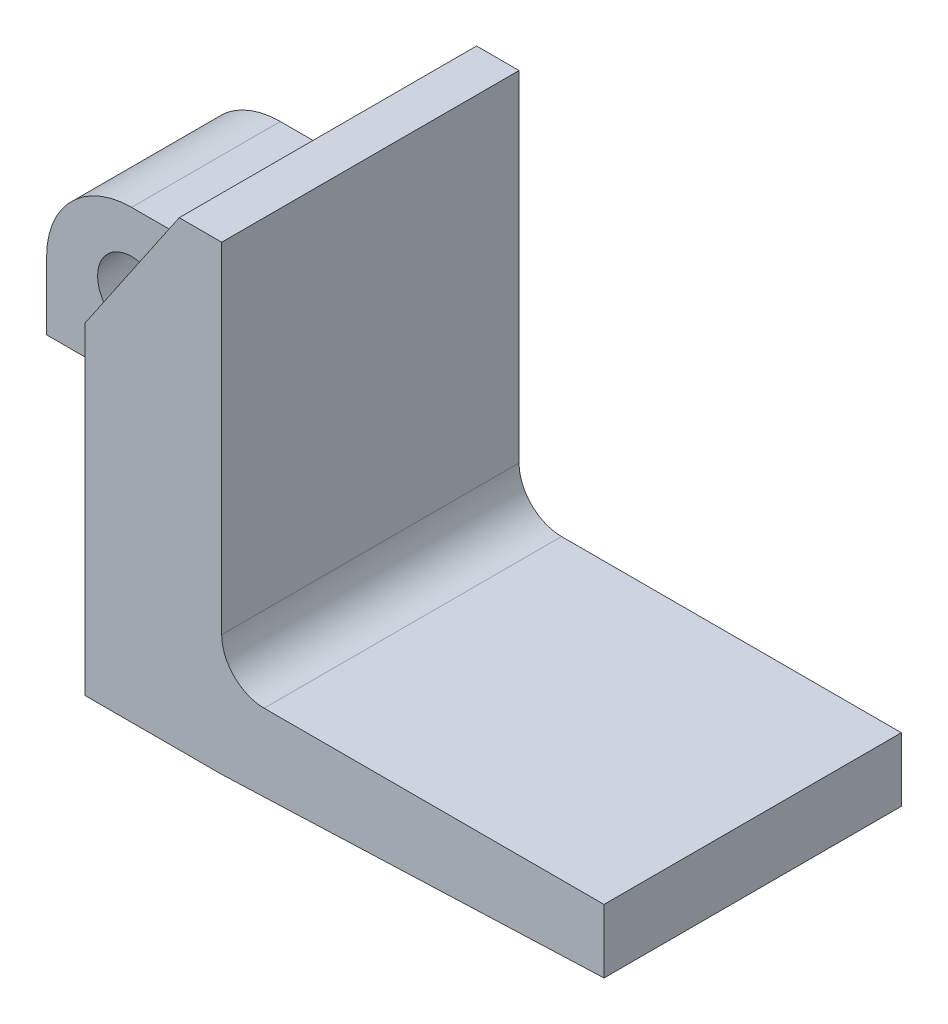
ISO-10303-21;
HEADER;
FILE_DESCRIPTION(('STEP AP214'),'2;1');
FILE_NAME('part.step','',(''),(''),'','','');
FILE_SCHEMA(('AUTOMOTIVE_DESIGN { 1 0 10303 214 1 1 1 1 }'));
ENDSEC;
DATA;
#1=APPLICATION_CONTEXT('core data for automotive mechanical design processes');
#2=APPLICATION_PROTOCOL_DEFINITION('international standard','automotive_design',2000,#1);
#3=PRODUCT_CONTEXT('',#1,'mechanical');
#4=PRODUCT('Part','Part','',(#3));
#5=PRODUCT_RELATED_PRODUCT_CATEGORY('part','',(#4));
#6=PRODUCT_DEFINITION_FORMATION('','',#4);
#7=PRODUCT_DEFINITION_CONTEXT('part definition',#1,'design');
#8=PRODUCT_DEFINITION('design','',#6,#7);
#9=PRODUCT_DEFINITION_SHAPE('','',#8);
#10=(LENGTH_UNIT() NAMED_UNIT(*) SI_UNIT(.MILLI.,.METRE.));
#11=(NAMED_UNIT(*) PLANE_ANGLE_UNIT() SI_UNIT($,.RADIAN.));
#12=(NAMED_UNIT(*) SI_UNIT($,.STERADIAN.) SOLID_ANGLE_UNIT());
#13=UNCERTAINTY_MEASURE_WITH_UNIT(LENGTH_MEASURE(1.E-05),#10,'distance_accuracy_value','');
#14=(GEOMETRIC_REPRESENTATION_CONTEXT(3) GLOBAL_UNCERTAINTY_ASSIGNED_CONTEXT((#13)) GLOBAL_UNIT_ASSIGNED_CONTEXT((#10,
#11,#12)) REPRESENTATION_CONTEXT('',''));
#15=CARTESIAN_POINT('',(0.,0.,0.));
#16=DIRECTION('',(0.,0.,1.));
#17=DIRECTION('',(1.,0.,0.));
#18=AXIS2_PLACEMENT_3D('',#15,#16,#17);
#19=CARTESIAN_POINT('',(-35.6902,32.7054976,44.45));
#20=DIRECTION('',(0.,-1.,0.));
#21=DIRECTION('',(1.,0.,0.));
#22=AXIS2_PLACEMENT_3D('',#19,#20,#21);
#23=PLANE('',#22);
#24=DIRECTION('',(-1.,0.,0.));
#25=VECTOR('',#24,1.);
#26=CARTESIAN_POINT('',(-22.9902,32.7054976,22.225));
#27=LINE('',#26,#25);
#28=CARTESIAN_POINT('',(-24.333799736365,32.7054976,22.225));
#29=VERTEX_POINT('',#28);
#30=CARTESIAN_POINT('',(-35.6902,32.7054976,22.225));
#31=VERTEX_POINT('',#30);
#32=EDGE_CURVE('E209',#29,#31,#27,.T.);
#33=ORIENTED_EDGE('',*,*,#32,.F.);
#34=DIRECTION('',(0.,0.,-1.));
#35=VECTOR('',#34,1.);
#36=CARTESIAN_POINT('',(-24.333799736365,32.7054976,0.));
#37=LINE('',#36,#35);
#38=CARTESIAN_POINT('',(-24.333799736365,32.7054976,0.));
#39=VERTEX_POINT('',#38);
#40=EDGE_CURVE('E200',#29,#39,#37,.T.);
#41=ORIENTED_EDGE('',*,*,#40,.T.);
#42=DIRECTION('',(-1.,0.,0.));
#43=VECTOR('',#42,1.);
#44=CARTESIAN_POINT('',(-35.6902,32.7054976,0.));
#45=LINE('',#44,#43);
#46=CARTESIAN_POINT('',(-35.6902,32.7054976,0.));
#47=VERTEX_POINT('',#46);
#48=EDGE_CURVE('E208',#39,#47,#45,.T.);
#49=ORIENTED_EDGE('',*,*,#48,.T.);
#50=DIRECTION('',(0.,0.,-1.));
#51=VECTOR('',#50,1.);
#52=CARTESIAN_POINT('',(-35.6902,32.7054976,44.45));
#53=LINE('',#52,#51);
#54=EDGE_CURVE('E177',#31,#47,#53,.T.);
#55=ORIENTED_EDGE('',*,*,#54,.F.);
#56=EDGE_LOOP('',(#33,#41,#49,#55));
#57=FACE_BOUND('',#56,.T.);
#58=ADVANCED_FACE('F43',(#57),#23,.F.);
#59=CARTESIAN_POINT('',(-35.6902,20.0054976,44.45));
#60=DIRECTION('',(0.,0.,-1.));
#61=DIRECTION('',(-1.,0.,0.));
#62=AXIS2_PLACEMENT_3D('',#59,#60,#61);
#63=CYLINDRICAL_SURFACE('',#62,12.7);
#64=CARTESIAN_POINT('',(-35.6902,20.0054976,22.225));
#65=DIRECTION('',(0.,0.,1.));
#66=DIRECTION('',(1.,0.,0.));
#67=AXIS2_PLACEMENT_3D('',#64,#65,#66);
#68=CIRCLE('',#67,12.7);
#69=CARTESIAN_POINT('',(-48.3902,20.0054976,22.225));
#70=VERTEX_POINT('',#69);
#71=EDGE_CURVE('E158',#31,#70,#68,.T.);
#72=ORIENTED_EDGE('',*,*,#71,.F.);
#73=ORIENTED_EDGE('',*,*,#54,.T.);
#74=CARTESIAN_POINT('',(-35.6902,20.0054976,0.));
#75=DIRECTION('',(0.,0.,1.));
#76=DIRECTION('',(1.,0.,0.));
#77=AXIS2_PLACEMENT_3D('',#74,#75,#76);
#78=CIRCLE('',#77,12.7);
#79=CARTESIAN_POINT('',(-48.3902,20.0054976,0.));
#80=VERTEX_POINT('',#79);
#81=EDGE_CURVE('E216',#47,#80,#78,.T.);
#82=ORIENTED_EDGE('',*,*,#81,.T.);
#83=DIRECTION('',(0.,0.,-1.));
#84=VECTOR('',#83,1.);
#85=CARTESIAN_POINT('',(-48.3902,20.0054976,44.45));
#86=LINE('',#85,#84);
#87=EDGE_CURVE('E175',#70,#80,#86,.T.);
#88=ORIENTED_EDGE('',*,*,#87,.F.);
#89=EDGE_LOOP('',(#72,#73,#82,#88));
#90=FACE_BOUND('',#89,.T.);
#91=ADVANCED_FACE('F329',(#90),#63,.T.);
#92=CARTESIAN_POINT('',(-48.3902,9.8454976,44.45));
#93=DIRECTION('',(1.,0.,0.));
#94=DIRECTION('',(0.,1.,0.));
#95=AXIS2_PLACEMENT_3D('',#92,#93,#94);
#96=PLANE('',#95);
#97=DIRECTION('',(0.,-1.,0.));
#98=VECTOR('',#97,1.);
#99=CARTESIAN_POINT('',(-48.3902,20.0054976,22.225));
#100=LINE('',#99,#98);
#101=CARTESIAN_POINT('',(-48.3902,9.8454976,22.225));
#102=VERTEX_POINT('',#101);
#103=EDGE_CURVE('E151',#70,#102,#100,.T.);
#104=ORIENTED_EDGE('',*,*,#103,.F.);
#105=ORIENTED_EDGE('',*,*,#87,.T.);
#106=DIRECTION('',(0.,-1.,0.));
#107=VECTOR('',#106,1.);
#108=CARTESIAN_POINT('',(-48.3902,9.8454976,0.));
#109=LINE('',#108,#107);
#110=CARTESIAN_POINT('',(-48.3902,9.8454976,0.));
#111=VERTEX_POINT('',#110);
#112=EDGE_CURVE('E173',#80,#111,#109,.T.);
#113=ORIENTED_EDGE('',*,*,#112,.T.);
#114=DIRECTION('',(0.,0.,-1.));
#115=VECTOR('',#114,1.);
#116=CARTESIAN_POINT('',(-48.3902,9.8454976,44.45));
#117=LINE('',#116,#115);
#118=EDGE_CURVE('E166',#102,#111,#117,.T.);
#119=ORIENTED_EDGE('',*,*,#118,.F.);
#120=EDGE_LOOP('',(#104,#105,#113,#119));
#121=FACE_BOUND('',#120,.T.);
#122=ADVANCED_FACE('F171',(#121),#96,.F.);
#123=CARTESIAN_POINT('',(-20.4502,9.84549760000001,44.45));
#124=DIRECTION('',(0.,1.,0.));
#125=DIRECTION('',(-1.,0.,0.));
#126=AXIS2_PLACEMENT_3D('',#123,#124,#125);
#127=PLANE('',#126);
#128=DIRECTION('',(1.,0.,0.));
#129=VECTOR('',#128,1.);
#130=CARTESIAN_POINT('',(-48.3902,9.8454976,22.225));
#131=LINE('',#130,#129);
#132=CARTESIAN_POINT('',(-20.4502,9.84549760000001,22.225));
#133=VERTEX_POINT('',#132);
#134=EDGE_CURVE('E155',#102,#133,#131,.T.);
#135=ORIENTED_EDGE('',*,*,#134,.F.);
#136=ORIENTED_EDGE('',*,*,#118,.T.);
#137=DIRECTION('',(1.,0.,0.));
#138=VECTOR('',#137,1.);
#139=CARTESIAN_POINT('',(-20.4502,9.84549760000001,0.));
#140=LINE('',#139,#138);
#141=CARTESIAN_POINT('',(-20.4502,9.84549760000001,0.));
#142=VERTEX_POINT('',#141);
#143=EDGE_CURVE('E225',#111,#142,#140,.T.);
#144=ORIENTED_EDGE('',*,*,#143,.T.);
#145=DIRECTION('',(0.,0.,-1.));
#146=VECTOR('',#145,1.);
#147=CARTESIAN_POINT('',(-20.4502,9.84549760000001,44.45));
#148=LINE('',#147,#146);
#149=EDGE_CURVE('E168',#133,#142,#148,.T.);
#150=ORIENTED_EDGE('',*,*,#149,.F.);
#151=EDGE_LOOP('',(#135,#136,#144,#150));
#152=FACE_BOUND('',#151,.T.);
#153=ADVANCED_FACE('F164',(#152),#127,.F.);
#154=CARTESIAN_POINT('',(0.,57.15,44.45));
#155=DIRECTION('',(-1.,0.,0.));
#156=DIRECTION('',(0.,-1.,0.));
#157=AXIS2_PLACEMENT_3D('',#154,#155,#156);
#158=PLANE('',#157);
#159=DIRECTION('',(0.,1.,0.));
#160=VECTOR('',#159,1.);
#161=CARTESIAN_POINT('',(0.,57.15,44.45));
#162=LINE('',#161,#160);
#163=CARTESIAN_POINT('',(0.,6.35,44.45));
#164=VERTEX_POINT('',#163);
#165=CARTESIAN_POINT('',(0.,57.15,44.45));
#166=VERTEX_POINT('',#165);
#167=EDGE_CURVE('E238',#164,#166,#162,.T.);
#168=ORIENTED_EDGE('',*,*,#167,.F.);
#169=DIRECTION('',(0.,0.,-1.));
#170=VECTOR('',#169,1.);
#171=CARTESIAN_POINT('',(0.,6.35,0.));
#172=LINE('',#171,#170);
#173=CARTESIAN_POINT('',(0.,6.35,0.));
#174=VERTEX_POINT('',#173);
#175=EDGE_CURVE('E191',#164,#174,#172,.T.);
#176=ORIENTED_EDGE('',*,*,#175,.T.);
#177=DIRECTION('',(0.,1.,0.));
#178=VECTOR('',#177,1.);
#179=CARTESIAN_POINT('',(0.,57.15,0.));
#180=LINE('',#179,#178);
#181=CARTESIAN_POINT('',(0.,57.15,0.));
#182=VERTEX_POINT('',#181);
#183=EDGE_CURVE('E279',#174,#182,#180,.T.);
#184=ORIENTED_EDGE('',*,*,#183,.T.);
#185=DIRECTION('',(0.,0.,-1.));
#186=VECTOR('',#185,1.);
#187=CARTESIAN_POINT('',(0.,57.15,44.45));
#188=LINE('',#187,#186);
#189=EDGE_CURVE('E188',#166,#182,#188,.T.);
#190=ORIENTED_EDGE('',*,*,#189,.F.);
#191=EDGE_LOOP('',(#168,#176,#184,#190));
#192=FACE_BOUND('',#191,.T.);
#193=ADVANCED_FACE('F310',(#192),#158,.F.);
#194=CARTESIAN_POINT('',(-6.35,57.15,44.45));
#195=DIRECTION('',(0.,-1.,0.));
#196=DIRECTION('',(0.,0.,-1.));
#197=AXIS2_PLACEMENT_3D('',#194,#195,#196);
#198=PLANE('',#197);
#199=DIRECTION('',(-1.,0.,0.));
#200=VECTOR('',#199,1.);
#201=CARTESIAN_POINT('',(-6.35,57.15,0.));
#202=LINE('',#201,#200);
#203=CARTESIAN_POINT('',(-6.35,57.15,0.));
#204=VERTEX_POINT('',#203);
#205=EDGE_CURVE('E220',#182,#204,#202,.T.);
#206=ORIENTED_EDGE('',*,*,#205,.T.);
#207=DIRECTION('',(0.,0.,-1.));
#208=VECTOR('',#207,1.);
#209=CARTESIAN_POINT('',(-6.35,57.15,44.45));
#210=LINE('',#209,#208);
#211=CARTESIAN_POINT('',(-6.35,57.15,44.45));
#212=VERTEX_POINT('',#211);
#213=EDGE_CURVE('E185',#212,#204,#210,.T.);
#214=ORIENTED_EDGE('',*,*,#213,.F.);
#215=DIRECTION('',(-1.,0.,0.));
#216=VECTOR('',#215,1.);
#217=CARTESIAN_POINT('',(-6.35,57.15,44.45));
#218=LINE('',#217,#216);
#219=EDGE_CURVE('E293',#166,#212,#218,.T.);
#220=ORIENTED_EDGE('',*,*,#219,.F.);
#221=ORIENTED_EDGE('',*,*,#189,.T.);
#222=EDGE_LOOP('',(#206,#214,#220,#221));
#223=FACE_BOUND('',#222,.T.);
#224=ADVANCED_FACE('F284',(#223),#198,.F.);
#225=CARTESIAN_POINT('',(-22.9902,32.7054976,44.45));
#226=DIRECTION('',(0.826644323966202,-0.56272476545329,0.));
#227=DIRECTION('',(0.56272476545329,0.826644323966202,0.));
#228=AXIS2_PLACEMENT_3D('',#225,#226,#227);
#229=PLANE('',#228);
#230=DIRECTION('',(-0.56272476545329,-0.826644323966202,0.));
#231=VECTOR('',#230,1.);
#232=CARTESIAN_POINT('',(-22.9902,32.7054976,0.));
#233=LINE('',#232,#231);
#234=CARTESIAN_POINT('',(-22.2341231534909,33.8161766957486,0.));
#235=VERTEX_POINT('',#234);
#236=EDGE_CURVE('E217',#204,#235,#233,.T.);
#237=ORIENTED_EDGE('',*,*,#236,.T.);
#238=DIRECTION('',(0.,0.,-1.));
#239=VECTOR('',#238,1.);
#240=CARTESIAN_POINT('',(-22.2341231534909,33.8161766957486,22.225));
#241=LINE('',#240,#239);
#242=CARTESIAN_POINT('',(-22.2341231534909,33.8161766957486,22.225));
#243=VERTEX_POINT('',#242);
#244=EDGE_CURVE('E65',#235,#243,#241,.F.);
#245=ORIENTED_EDGE('',*,*,#244,.T.);
#246=DIRECTION('',(-0.562724765453292,-0.826644323966201,0.));
#247=VECTOR('',#246,1.);
#248=CARTESIAN_POINT('',(-20.4502,36.4367650184204,22.225));
#249=LINE('',#248,#247);
#250=CARTESIAN_POINT('',(-20.4502,36.4367650184204,22.225));
#251=VERTEX_POINT('',#250);
#252=EDGE_CURVE('E301',#251,#243,#249,.T.);
#253=ORIENTED_EDGE('',*,*,#252,.F.);
#254=DIRECTION('',(0.,0.,1.));
#255=VECTOR('',#254,1.);
#256=CARTESIAN_POINT('',(-20.4502,36.4367650184204,22.225));
#257=LINE('',#256,#255);
#258=CARTESIAN_POINT('',(-20.4502,36.4367650184204,44.45));
#259=VERTEX_POINT('',#258);
#260=EDGE_CURVE('E280',#251,#259,#257,.T.);
#261=ORIENTED_EDGE('',*,*,#260,.T.);
#262=DIRECTION('',(-0.56272476545329,-0.826644323966202,0.));
#263=VECTOR('',#262,1.);
#264=CARTESIAN_POINT('',(-22.9902,32.7054976,44.45));
#265=LINE('',#264,#263);
#266=EDGE_CURVE('E291',#212,#259,#265,.T.);
#267=ORIENTED_EDGE('',*,*,#266,.F.);
#268=ORIENTED_EDGE('',*,*,#213,.T.);
#269=EDGE_LOOP('',(#237,#245,#253,#261,#267,#268));
#270=FACE_BOUND('',#269,.T.);
#271=ADVANCED_FACE('F288',(#270),#229,.F.);
#272=CARTESIAN_POINT('',(-20.4502,9.84549760000001,44.45));
#273=DIRECTION('',(1.,0.,0.));
#274=DIRECTION('',(0.,1.,0.));
#275=AXIS2_PLACEMENT_3D('',#272,#273,#274);
#276=PLANE('',#275);
#277=DIRECTION('',(0.,-1.,0.));
#278=VECTOR('',#277,1.);
#279=CARTESIAN_POINT('',(-20.4502,9.84549760000001,0.));
#280=LINE('',#279,#278);
#281=CARTESIAN_POINT('',(-20.4502,-11.7445024,0.));
#282=VERTEX_POINT('',#281);
#283=EDGE_CURVE('E227',#142,#282,#280,.T.);
#284=ORIENTED_EDGE('',*,*,#283,.T.);
#285=DIRECTION('',(0.,0.,-1.));
#286=VECTOR('',#285,1.);
#287=CARTESIAN_POINT('',(-20.4502,-11.7445024,44.45));
#288=LINE('',#287,#286);
#289=CARTESIAN_POINT('',(-20.4502,-11.7445024,44.45));
#290=VERTEX_POINT('',#289);
#291=EDGE_CURVE('E179',#290,#282,#288,.T.);
#292=ORIENTED_EDGE('',*,*,#291,.F.);
#293=DIRECTION('',(0.,-1.,0.));
#294=VECTOR('',#293,1.);
#295=CARTESIAN_POINT('',(-20.4502,9.84549760000001,44.45));
#296=LINE('',#295,#294);
#297=EDGE_CURVE('E292',#259,#290,#296,.T.);
#298=ORIENTED_EDGE('',*,*,#297,.F.);
#299=ORIENTED_EDGE('',*,*,#260,.F.);
#300=DIRECTION('',(0.,1.,0.));
#301=VECTOR('',#300,1.);
#302=CARTESIAN_POINT('',(-20.4502,9.84549760000001,22.225));
#303=LINE('',#302,#301);
#304=EDGE_CURVE('E169',#133,#251,#303,.T.);
#305=ORIENTED_EDGE('',*,*,#304,.F.);
#306=ORIENTED_EDGE('',*,*,#149,.T.);
#307=EDGE_LOOP('',(#284,#292,#298,#299,#305,#306));
#308=FACE_BOUND('',#307,.T.);
#309=ADVANCED_FACE('F299',(#308),#276,.F.);
#310=CARTESIAN_POINT('',(-20.4502,-11.7445024,44.45));
#311=DIRECTION('',(0.,1.,0.));
#312=DIRECTION('',(-1.,0.,0.));
#313=AXIS2_PLACEMENT_3D('',#310,#311,#312);
#314=PLANE('',#313);
#315=DIRECTION('',(1.,0.,0.));
#316=VECTOR('',#315,1.);
#317=CARTESIAN_POINT('',(-20.4502,-11.7445024,0.));
#318=LINE('',#317,#316);
#319=CARTESIAN_POINT('',(0.,-11.7445024,0.));
#320=VERTEX_POINT('',#319);
#321=EDGE_CURVE('E229',#282,#320,#318,.T.);
#322=ORIENTED_EDGE('',*,*,#321,.T.);
#323=DIRECTION('',(0.,0.,-1.));
#324=VECTOR('',#323,1.);
#325=CARTESIAN_POINT('',(0.,-11.7445024,44.45));
#326=LINE('',#325,#324);
#327=CARTESIAN_POINT('',(0.,-11.7445024,44.45));
#328=VERTEX_POINT('',#327);
#329=EDGE_CURVE('E246',#328,#320,#326,.T.);
#330=ORIENTED_EDGE('',*,*,#329,.F.);
#331=DIRECTION('',(1.,0.,0.));
#332=VECTOR('',#331,1.);
#333=CARTESIAN_POINT('',(-20.4502,-11.7445024,44.45));
#334=LINE('',#333,#332);
#335=EDGE_CURVE('E255',#290,#328,#334,.T.);
#336=ORIENTED_EDGE('',*,*,#335,.F.);
#337=ORIENTED_EDGE('',*,*,#291,.T.);
#338=EDGE_LOOP('',(#322,#330,#336,#337));
#339=FACE_BOUND('',#338,.T.);
#340=ADVANCED_FACE('F253',(#339),#314,.F.);
#341=CARTESIAN_POINT('',(0.,-11.7445024,44.45));
#342=DIRECTION('',(-0.0388071826393708,0.999246717570588,0.));
#343=DIRECTION('',(-0.999246717570588,-0.0388071826393708,0.));
#344=AXIS2_PLACEMENT_3D('',#341,#342,#343);
#345=PLANE('',#344);
#346=DIRECTION('',(0.999246717570588,0.0388071826393708,0.));
#347=VECTOR('',#346,1.);
#348=CARTESIAN_POINT('',(0.,-11.7445024,0.));
#349=LINE('',#348,#347);
#350=CARTESIAN_POINT('',(57.15,-9.525,0.));
#351=VERTEX_POINT('',#350);
#352=EDGE_CURVE('E231',#320,#351,#349,.T.);
#353=ORIENTED_EDGE('',*,*,#352,.T.);
#354=DIRECTION('',(0.,0.,-1.));
#355=VECTOR('',#354,1.);
#356=CARTESIAN_POINT('',(57.15,-9.525,44.45));
#357=LINE('',#356,#355);
#358=CARTESIAN_POINT('',(57.15,-9.525,44.45));
#359=VERTEX_POINT('',#358);
#360=EDGE_CURVE('E242',#359,#351,#357,.T.);
#361=ORIENTED_EDGE('',*,*,#360,.F.);
#362=DIRECTION('',(0.999246717570588,0.0388071826393708,0.));
#363=VECTOR('',#362,1.);
#364=CARTESIAN_POINT('',(0.,-11.7445024,44.45));
#365=LINE('',#364,#363);
#366=EDGE_CURVE('E273',#328,#359,#365,.T.);
#367=ORIENTED_EDGE('',*,*,#366,.F.);
#368=ORIENTED_EDGE('',*,*,#329,.T.);
#369=EDGE_LOOP('',(#353,#361,#367,#368));
#370=FACE_BOUND('',#369,.T.);
#371=ADVANCED_FACE('F263',(#370),#345,.F.);
#372=CARTESIAN_POINT('',(57.15,0.,44.45));
#373=DIRECTION('',(-1.,0.,0.));
#374=DIRECTION('',(0.,-1.,0.));
#375=AXIS2_PLACEMENT_3D('',#372,#373,#374);
#376=PLANE('',#375);
#377=DIRECTION('',(0.,1.,0.));
#378=VECTOR('',#377,1.);
#379=CARTESIAN_POINT('',(57.15,0.,0.));
#380=LINE('',#379,#378);
#381=CARTESIAN_POINT('',(57.15,0.,0.));
#382=VERTEX_POINT('',#381);
#383=EDGE_CURVE('E233',#351,#382,#380,.T.);
#384=ORIENTED_EDGE('',*,*,#383,.T.);
#385=DIRECTION('',(0.,0.,-1.));
#386=VECTOR('',#385,1.);
#387=CARTESIAN_POINT('',(57.15,0.,44.45));
#388=LINE('',#387,#386);
#389=CARTESIAN_POINT('',(57.15,0.,44.45));
#390=VERTEX_POINT('',#389);
#391=EDGE_CURVE('E239',#390,#382,#388,.T.);
#392=ORIENTED_EDGE('',*,*,#391,.F.);
#393=DIRECTION('',(0.,1.,0.));
#394=VECTOR('',#393,1.);
#395=CARTESIAN_POINT('',(57.15,0.,44.45));
#396=LINE('',#395,#394);
#397=EDGE_CURVE('E269',#359,#390,#396,.T.);
#398=ORIENTED_EDGE('',*,*,#397,.F.);
#399=ORIENTED_EDGE('',*,*,#360,.T.);
#400=EDGE_LOOP('',(#384,#392,#398,#399));
#401=FACE_BOUND('',#400,.T.);
#402=ADVANCED_FACE('F267',(#401),#376,.F.);
#403=CARTESIAN_POINT('',(0.,0.,44.45));
#404=DIRECTION('',(0.,-1.,0.));
#405=DIRECTION('',(0.,0.,-1.));
#406=AXIS2_PLACEMENT_3D('',#403,#404,#405);
#407=PLANE('',#406);
#408=DIRECTION('',(-1.,0.,0.));
#409=VECTOR('',#408,1.);
#410=CARTESIAN_POINT('',(0.,0.,0.));
#411=LINE('',#410,#409);
#412=CARTESIAN_POINT('',(6.35,0.,0.));
#413=VERTEX_POINT('',#412);
#414=EDGE_CURVE('E235',#382,#413,#411,.T.);
#415=ORIENTED_EDGE('',*,*,#414,.T.);
#416=DIRECTION('',(0.,0.,-1.));
#417=VECTOR('',#416,1.);
#418=CARTESIAN_POINT('',(6.35,0.,44.45));
#419=LINE('',#418,#417);
#420=CARTESIAN_POINT('',(6.35,0.,44.45));
#421=VERTEX_POINT('',#420);
#422=EDGE_CURVE('E194',#413,#421,#419,.F.);
#423=ORIENTED_EDGE('',*,*,#422,.T.);
#424=DIRECTION('',(-1.,0.,0.));
#425=VECTOR('',#424,1.);
#426=CARTESIAN_POINT('',(0.,0.,44.45));
#427=LINE('',#426,#425);
#428=EDGE_CURVE('E243',#390,#421,#427,.T.);
#429=ORIENTED_EDGE('',*,*,#428,.F.);
#430=ORIENTED_EDGE('',*,*,#391,.T.);
#431=EDGE_LOOP('',(#415,#423,#429,#430));
#432=FACE_BOUND('',#431,.T.);
#433=ADVANCED_FACE('F314',(#432),#407,.F.);
#434=CARTESIAN_POINT('',(-35.6902,20.0054976,44.45));
#435=DIRECTION('',(0.,0.,1.));
#436=DIRECTION('',(1.,0.,0.));
#437=AXIS2_PLACEMENT_3D('',#434,#435,#436);
#438=PLANE('',#437);
#439=ORIENTED_EDGE('',*,*,#266,.T.);
#440=ORIENTED_EDGE('',*,*,#297,.T.);
#441=ORIENTED_EDGE('',*,*,#335,.T.);
#442=ORIENTED_EDGE('',*,*,#366,.T.);
#443=ORIENTED_EDGE('',*,*,#397,.T.);
#444=ORIENTED_EDGE('',*,*,#428,.T.);
#445=CARTESIAN_POINT('',(6.35,6.35,44.45));
#446=DIRECTION('',(0.,0.,1.));
#447=DIRECTION('',(1.,0.,0.));
#448=AXIS2_PLACEMENT_3D('',#445,#446,#447);
#449=CIRCLE('',#448,6.35);
#450=EDGE_CURVE('E198',#421,#164,#449,.F.);
#451=ORIENTED_EDGE('',*,*,#450,.T.);
#452=ORIENTED_EDGE('',*,*,#167,.T.);
#453=ORIENTED_EDGE('',*,*,#219,.T.);
#454=EDGE_LOOP('',(#439,#440,#441,#442,#443,#444,#451,#452,#453));
#455=FACE_BOUND('',#454,.T.);
#456=ADVANCED_FACE('F298',(#455),#438,.T.);
#457=CARTESIAN_POINT('',(-35.6902,20.0054976,0.));
#458=DIRECTION('',(0.,0.,1.));
#459=DIRECTION('',(1.,0.,0.));
#460=AXIS2_PLACEMENT_3D('',#457,#458,#459);
#461=PLANE('',#460);
#462=CARTESIAN_POINT('',(-35.6902,21.2754976,0.));
#463=DIRECTION('',(0.,0.,-1.));
#464=DIRECTION('',(-1.,0.,0.));
#465=AXIS2_PLACEMENT_3D('',#462,#463,#464);
#466=CIRCLE('',#465,5.07999999999999);
#467=CARTESIAN_POINT('',(-40.7702,21.2754976,0.));
#468=VERTEX_POINT('',#467);
#469=EDGE_CURVE('E371',#468,#468,#466,.T.);
#470=ORIENTED_EDGE('',*,*,#469,.F.);
#471=EDGE_LOOP('',(#470));
#472=FACE_BOUND('',#471,.T.);
#473=ORIENTED_EDGE('',*,*,#183,.F.);
#474=CARTESIAN_POINT('',(6.35,6.35,0.));
#475=DIRECTION('',(0.,0.,1.));
#476=DIRECTION('',(1.,0.,0.));
#477=AXIS2_PLACEMENT_3D('',#474,#475,#476);
#478=CIRCLE('',#477,6.35);
#479=EDGE_CURVE('E196',#174,#413,#478,.T.);
#480=ORIENTED_EDGE('',*,*,#479,.T.);
#481=ORIENTED_EDGE('',*,*,#414,.F.);
#482=ORIENTED_EDGE('',*,*,#383,.F.);
#483=ORIENTED_EDGE('',*,*,#352,.F.);
#484=ORIENTED_EDGE('',*,*,#321,.F.);
#485=ORIENTED_EDGE('',*,*,#283,.F.);
#486=ORIENTED_EDGE('',*,*,#143,.F.);
#487=ORIENTED_EDGE('',*,*,#112,.F.);
#488=ORIENTED_EDGE('',*,*,#81,.F.);
#489=ORIENTED_EDGE('',*,*,#48,.F.);
#490=CARTESIAN_POINT('',(-24.333799736365,35.2454976,0.));
#491=DIRECTION('',(0.,0.,1.));
#492=DIRECTION('',(1.,0.,0.));
#493=AXIS2_PLACEMENT_3D('',#490,#491,#492);
#494=CIRCLE('',#493,2.54);
#495=EDGE_CURVE('E52',#39,#235,#494,.T.);
#496=ORIENTED_EDGE('',*,*,#495,.T.);
#497=ORIENTED_EDGE('',*,*,#236,.F.);
#498=ORIENTED_EDGE('',*,*,#205,.F.);
#499=EDGE_LOOP('',(#473,#480,#481,#482,#483,#484,#485,#486,#487,#488,#489,#496,#497,#498));
#500=FACE_BOUND('',#499,.T.);
#501=ADVANCED_FACE('F214',(#472,#500),#461,.F.);
#502=CARTESIAN_POINT('',(6.35,6.35,44.45));
#503=DIRECTION('',(0.,0.,1.));
#504=DIRECTION('',(1.,0.,0.));
#505=AXIS2_PLACEMENT_3D('',#502,#503,#504);
#506=CYLINDRICAL_SURFACE('',#505,6.35);
#507=ORIENTED_EDGE('',*,*,#450,.F.);
#508=ORIENTED_EDGE('',*,*,#422,.F.);
#509=ORIENTED_EDGE('',*,*,#479,.F.);
#510=ORIENTED_EDGE('',*,*,#175,.F.);
#511=EDGE_LOOP('',(#507,#508,#509,#510));
#512=FACE_BOUND('',#511,.T.);
#513=ADVANCED_FACE('F315',(#512),#506,.F.);
#514=CARTESIAN_POINT('',(-35.6902,20.0054976,22.225));
#515=DIRECTION('',(0.,0.,1.));
#516=DIRECTION('',(1.,0.,0.));
#517=AXIS2_PLACEMENT_3D('',#514,#515,#516);
#518=PLANE('',#517);
#519=CARTESIAN_POINT('',(-35.6902,21.2754976,22.225));
#520=DIRECTION('',(0.,0.,1.));
#521=DIRECTION('',(1.,0.,0.));
#522=AXIS2_PLACEMENT_3D('',#519,#520,#521);
#523=CIRCLE('',#522,5.07999999999999);
#524=CARTESIAN_POINT('',(-30.6102,21.2754976,22.225));
#525=VERTEX_POINT('',#524);
#526=EDGE_CURVE('E47',#525,#525,#523,.T.);
#527=ORIENTED_EDGE('',*,*,#526,.F.);
#528=EDGE_LOOP('',(#527));
#529=FACE_BOUND('',#528,.T.);
#530=ORIENTED_EDGE('',*,*,#103,.T.);
#531=ORIENTED_EDGE('',*,*,#134,.T.);
#532=ORIENTED_EDGE('',*,*,#304,.T.);
#533=ORIENTED_EDGE('',*,*,#252,.T.);
#534=CARTESIAN_POINT('',(-24.333799736365,35.2454976,22.225));
#535=DIRECTION('',(0.,0.,1.));
#536=DIRECTION('',(1.,0.,0.));
#537=AXIS2_PLACEMENT_3D('',#534,#535,#536);
#538=CIRCLE('',#537,2.54);
#539=EDGE_CURVE('E11',#243,#29,#538,.F.);
#540=ORIENTED_EDGE('',*,*,#539,.T.);
#541=ORIENTED_EDGE('',*,*,#32,.T.);
#542=ORIENTED_EDGE('',*,*,#71,.T.);
#543=EDGE_LOOP('',(#530,#531,#532,#533,#540,#541,#542));
#544=FACE_BOUND('',#543,.T.);
#545=ADVANCED_FACE('F153',(#529,#544),#518,.T.);
#546=CARTESIAN_POINT('',(-24.333799736365,35.2454976,44.45));
#547=DIRECTION('',(0.,0.,1.));
#548=DIRECTION('',(1.,0.,0.));
#549=AXIS2_PLACEMENT_3D('',#546,#547,#548);
#550=CYLINDRICAL_SURFACE('',#549,2.54);
#551=ORIENTED_EDGE('',*,*,#539,.F.);
#552=ORIENTED_EDGE('',*,*,#244,.F.);
#553=ORIENTED_EDGE('',*,*,#495,.F.);
#554=ORIENTED_EDGE('',*,*,#40,.F.);
#555=EDGE_LOOP('',(#551,#552,#553,#554));
#556=FACE_BOUND('',#555,.T.);
#557=ADVANCED_FACE('F45',(#556),#550,.F.);
#558=CARTESIAN_POINT('',(-35.6902,21.2754976,0.));
#559=DIRECTION('',(0.,0.,-1.));
#560=DIRECTION('',(-1.,0.,0.));
#561=AXIS2_PLACEMENT_3D('',#558,#559,#560);
#562=CYLINDRICAL_SURFACE('',#561,5.07999999999999);
#563=ORIENTED_EDGE('',*,*,#526,.T.);
#564=EDGE_LOOP('',(#563));
#565=FACE_BOUND('',#564,.T.);
#566=ORIENTED_EDGE('',*,*,#469,.T.);
#567=EDGE_LOOP('',(#566));
#568=FACE_BOUND('',#567,.T.);
#569=ADVANCED_FACE('F360',(#565,#568),#562,.F.);
#570=CLOSED_SHELL('',(#58,#91,#122,#153,#193,#224,#271,#309,#340,#371,#402,#433,#456,#501,#513,
#545,#557,#569));
#571=MANIFOLD_SOLID_BREP('B2',#570);
#572=ADVANCED_BREP_SHAPE_REPRESENTATION('',(#18,#571),#14);
#573=SHAPE_DEFINITION_REPRESENTATION(#9,#572);
ENDSEC;
END-ISO-10303-21;
